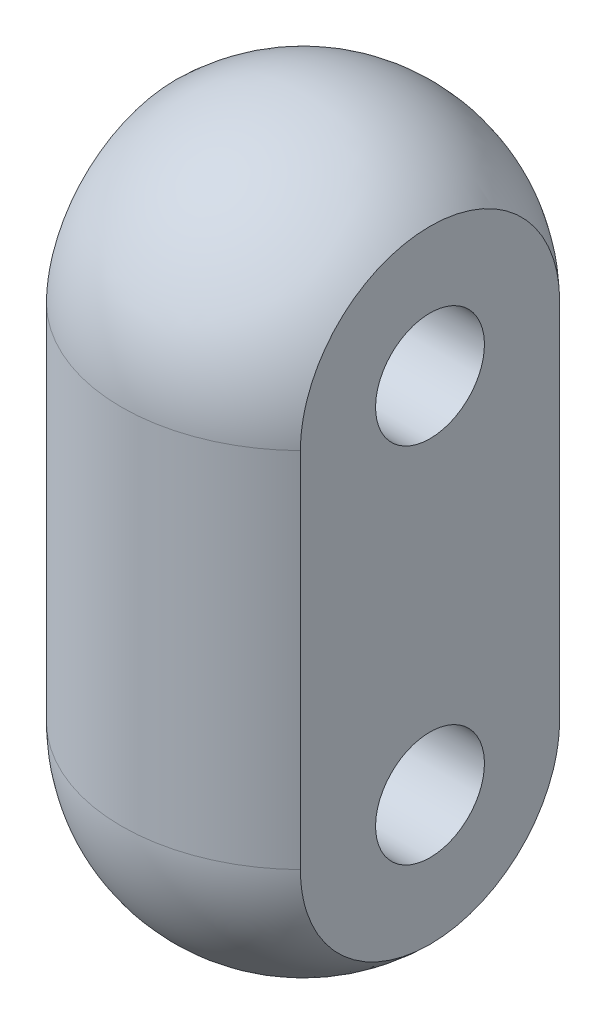
ISO-10303-21;
HEADER;
FILE_DESCRIPTION(('STEP AP214'),'2;1');
FILE_NAME('part.step','',(''),(''),'','','');
FILE_SCHEMA(('AUTOMOTIVE_DESIGN { 1 0 10303 214 1 1 1 1 }'));
ENDSEC;
DATA;
#1=APPLICATION_CONTEXT('core data for automotive mechanical design processes');
#2=APPLICATION_PROTOCOL_DEFINITION('international standard','automotive_design',2000,#1);
#3=PRODUCT_CONTEXT('',#1,'mechanical');
#4=PRODUCT('Part','Part','',(#3));
#5=PRODUCT_RELATED_PRODUCT_CATEGORY('part','',(#4));
#6=PRODUCT_DEFINITION_FORMATION('','',#4);
#7=PRODUCT_DEFINITION_CONTEXT('part definition',#1,'design');
#8=PRODUCT_DEFINITION('design','',#6,#7);
#9=PRODUCT_DEFINITION_SHAPE('','',#8);
#10=(LENGTH_UNIT() NAMED_UNIT(*) SI_UNIT(.MILLI.,.METRE.));
#11=(NAMED_UNIT(*) PLANE_ANGLE_UNIT() SI_UNIT($,.RADIAN.));
#12=(NAMED_UNIT(*) SI_UNIT($,.STERADIAN.) SOLID_ANGLE_UNIT());
#13=UNCERTAINTY_MEASURE_WITH_UNIT(LENGTH_MEASURE(1.E-05),#10,'distance_accuracy_value','');
#14=(GEOMETRIC_REPRESENTATION_CONTEXT(3) GLOBAL_UNCERTAINTY_ASSIGNED_CONTEXT((#13)) GLOBAL_UNIT_ASSIGNED_CONTEXT((#10,
#11,#12)) REPRESENTATION_CONTEXT('',''));
#15=CARTESIAN_POINT('',(0.,0.,0.));
#16=DIRECTION('',(0.,0.,1.));
#17=DIRECTION('',(1.,0.,0.));
#18=AXIS2_PLACEMENT_3D('',#15,#16,#17);
#19=CARTESIAN_POINT('',(0.,100.,0.));
#20=DIRECTION('',(0.,-1.,0.));
#21=DIRECTION('',(0.,0.,-1.));
#22=AXIS2_PLACEMENT_3D('',#19,#20,#21);
#23=CYLINDRICAL_SURFACE('',#22,25.);
#24=CARTESIAN_POINT('',(0.,75.,0.));
#25=DIRECTION('',(0.,-1.,0.));
#26=DIRECTION('',(0.,0.,-1.));
#27=AXIS2_PLACEMENT_3D('',#24,#25,#26);
#28=CIRCLE('',#27,25.);
#29=CARTESIAN_POINT('',(17.5,75.,17.8535710713571));
#30=VERTEX_POINT('',#29);
#31=CARTESIAN_POINT('',(-17.5,75.,17.8535710713571));
#32=VERTEX_POINT('',#31);
#33=EDGE_CURVE('E92',#30,#32,#28,.T.);
#34=ORIENTED_EDGE('',*,*,#33,.T.);
#35=DIRECTION('',(0.,-1.,0.));
#36=VECTOR('',#35,1.);
#37=CARTESIAN_POINT('',(-17.5,100.,17.8535710713571));
#38=LINE('',#37,#36);
#39=CARTESIAN_POINT('',(-17.5,25.,17.8535710713571));
#40=VERTEX_POINT('',#39);
#41=EDGE_CURVE('E105',#32,#40,#38,.T.);
#42=ORIENTED_EDGE('',*,*,#41,.T.);
#43=CARTESIAN_POINT('',(0.,25.,0.));
#44=DIRECTION('',(0.,-1.,0.));
#45=DIRECTION('',(0.,0.,-1.));
#46=AXIS2_PLACEMENT_3D('',#43,#44,#45);
#47=CIRCLE('',#46,25.);
#48=CARTESIAN_POINT('',(17.5,25.,17.8535710713571));
#49=VERTEX_POINT('',#48);
#50=EDGE_CURVE('E87',#40,#49,#47,.F.);
#51=ORIENTED_EDGE('',*,*,#50,.T.);
#52=DIRECTION('',(0.,-1.,0.));
#53=VECTOR('',#52,1.);
#54=CARTESIAN_POINT('',(17.5,100.,17.8535710713571));
#55=LINE('',#54,#53);
#56=EDGE_CURVE('E79',#49,#30,#55,.F.);
#57=ORIENTED_EDGE('',*,*,#56,.T.);
#58=EDGE_LOOP('',(#34,#42,#51,#57));
#59=FACE_BOUND('',#58,.T.);
#60=ADVANCED_FACE('F38',(#59),#23,.T.);
#61=CARTESIAN_POINT('',(17.5,25.,-17.8535710713571));
#62=VERTEX_POINT('',#61);
#63=CARTESIAN_POINT('',(-17.5,25.,-17.8535710713571));
#64=VERTEX_POINT('',#63);
#65=EDGE_CURVE('E97',#62,#64,#47,.F.);
#66=ORIENTED_EDGE('',*,*,#65,.T.);
#67=DIRECTION('',(0.,-1.,0.));
#68=VECTOR('',#67,1.);
#69=CARTESIAN_POINT('',(-17.5,100.,-17.8535710713571));
#70=LINE('',#69,#68);
#71=CARTESIAN_POINT('',(-17.5,75.,-17.8535710713571));
#72=VERTEX_POINT('',#71);
#73=EDGE_CURVE('E107',#64,#72,#70,.F.);
#74=ORIENTED_EDGE('',*,*,#73,.T.);
#75=CARTESIAN_POINT('',(17.5,75.,-17.8535710713571));
#76=VERTEX_POINT('',#75);
#77=EDGE_CURVE('E98',#72,#76,#28,.T.);
#78=ORIENTED_EDGE('',*,*,#77,.T.);
#79=DIRECTION('',(0.,-1.,0.));
#80=VECTOR('',#79,1.);
#81=CARTESIAN_POINT('',(17.5,100.,-17.8535710713571));
#82=LINE('',#81,#80);
#83=EDGE_CURVE('E82',#76,#62,#82,.T.);
#84=ORIENTED_EDGE('',*,*,#83,.T.);
#85=EDGE_LOOP('',(#66,#74,#78,#84));
#86=FACE_BOUND('',#85,.T.);
#87=ADVANCED_FACE('F145',(#86),#23,.T.);
#88=CARTESIAN_POINT('',(0.,25.,0.));
#89=DIRECTION('',(0.,0.,1.));
#90=DIRECTION('',(1.,0.,0.));
#91=AXIS2_PLACEMENT_3D('',#88,#89,#90);
#92=SPHERICAL_SURFACE('',#91,25.);
#93=CARTESIAN_POINT('',(0.,0.,0.));
#94=VERTEX_POINT('',#93);
#95=VERTEX_LOOP('',#94);
#96=FACE_BOUND('',#95,.T.);
#97=CARTESIAN_POINT('',(-17.5,25.,0.));
#98=DIRECTION('',(1.,0.,0.));
#99=DIRECTION('',(0.,1.,0.));
#100=AXIS2_PLACEMENT_3D('',#97,#98,#99);
#101=CIRCLE('',#100,17.8535710713571);
#102=EDGE_CURVE('E102',#64,#40,#101,.F.);
#103=ORIENTED_EDGE('',*,*,#102,.F.);
#104=ORIENTED_EDGE('',*,*,#65,.F.);
#105=CARTESIAN_POINT('',(17.5,25.,0.));
#106=DIRECTION('',(-1.,0.,0.));
#107=DIRECTION('',(0.,-1.,0.));
#108=AXIS2_PLACEMENT_3D('',#105,#106,#107);
#109=CIRCLE('',#108,17.8535710713571);
#110=EDGE_CURVE('E110',#49,#62,#109,.F.);
#111=ORIENTED_EDGE('',*,*,#110,.F.);
#112=ORIENTED_EDGE('',*,*,#50,.F.);
#113=EDGE_LOOP('',(#103,#104,#111,#112));
#114=FACE_BOUND('',#113,.T.);
#115=ADVANCED_FACE('F143',(#96,#114),#92,.T.);
#116=CARTESIAN_POINT('',(0.,75.,0.));
#117=DIRECTION('',(0.,0.,1.));
#118=DIRECTION('',(1.,0.,0.));
#119=AXIS2_PLACEMENT_3D('',#116,#117,#118);
#120=SPHERICAL_SURFACE('',#119,25.);
#121=CARTESIAN_POINT('',(0.,100.,0.));
#122=VERTEX_POINT('',#121);
#123=VERTEX_LOOP('',#122);
#124=FACE_BOUND('',#123,.T.);
#125=CARTESIAN_POINT('',(-17.5,75.,0.));
#126=DIRECTION('',(1.,0.,0.));
#127=DIRECTION('',(0.,1.,0.));
#128=AXIS2_PLACEMENT_3D('',#125,#126,#127);
#129=CIRCLE('',#128,17.8535710713571);
#130=EDGE_CURVE('E12',#32,#72,#129,.F.);
#131=ORIENTED_EDGE('',*,*,#130,.F.);
#132=ORIENTED_EDGE('',*,*,#33,.F.);
#133=CARTESIAN_POINT('',(17.5,75.,0.));
#134=DIRECTION('',(-1.,0.,0.));
#135=DIRECTION('',(0.,-1.,0.));
#136=AXIS2_PLACEMENT_3D('',#133,#134,#135);
#137=CIRCLE('',#136,17.8535710713571);
#138=EDGE_CURVE('E46',#76,#30,#137,.F.);
#139=ORIENTED_EDGE('',*,*,#138,.F.);
#140=ORIENTED_EDGE('',*,*,#77,.F.);
#141=EDGE_LOOP('',(#131,#132,#139,#140));
#142=FACE_BOUND('',#141,.T.);
#143=ADVANCED_FACE('F40',(#124,#142),#120,.T.);
#144=CARTESIAN_POINT('',(17.5,100.,200.));
#145=DIRECTION('',(-1.,0.,0.));
#146=DIRECTION('',(0.,-1.,0.));
#147=AXIS2_PLACEMENT_3D('',#144,#145,#146);
#148=PLANE('',#147);
#149=CARTESIAN_POINT('',(17.5,25.,0.));
#150=DIRECTION('',(-1.,0.,0.));
#151=DIRECTION('',(0.,-1.,0.));
#152=AXIS2_PLACEMENT_3D('',#149,#150,#151);
#153=CIRCLE('',#152,7.5);
#154=CARTESIAN_POINT('',(17.5,17.5,0.));
#155=VERTEX_POINT('',#154);
#156=EDGE_CURVE('E116',#155,#155,#153,.T.);
#157=ORIENTED_EDGE('',*,*,#156,.T.);
#158=EDGE_LOOP('',(#157));
#159=FACE_BOUND('',#158,.T.);
#160=CARTESIAN_POINT('',(17.5,75.,0.));
#161=DIRECTION('',(-1.,0.,0.));
#162=DIRECTION('',(0.,-1.,0.));
#163=AXIS2_PLACEMENT_3D('',#160,#161,#162);
#164=CIRCLE('',#163,7.5);
#165=CARTESIAN_POINT('',(17.5,67.5,0.));
#166=VERTEX_POINT('',#165);
#167=EDGE_CURVE('E94',#166,#166,#164,.T.);
#168=ORIENTED_EDGE('',*,*,#167,.T.);
#169=EDGE_LOOP('',(#168));
#170=FACE_BOUND('',#169,.T.);
#171=ORIENTED_EDGE('',*,*,#110,.T.);
#172=ORIENTED_EDGE('',*,*,#83,.F.);
#173=ORIENTED_EDGE('',*,*,#138,.T.);
#174=ORIENTED_EDGE('',*,*,#56,.F.);
#175=EDGE_LOOP('',(#171,#172,#173,#174));
#176=FACE_BOUND('',#175,.T.);
#177=ADVANCED_FACE('F78',(#159,#170,#176),#148,.F.);
#178=CARTESIAN_POINT('',(-17.5,100.,200.));
#179=DIRECTION('',(1.,0.,0.));
#180=DIRECTION('',(0.,1.,0.));
#181=AXIS2_PLACEMENT_3D('',#178,#179,#180);
#182=PLANE('',#181);
#183=CARTESIAN_POINT('',(-17.5,25.,0.));
#184=DIRECTION('',(-1.,0.,0.));
#185=DIRECTION('',(0.,-1.,0.));
#186=AXIS2_PLACEMENT_3D('',#183,#184,#185);
#187=CIRCLE('',#186,7.5);
#188=CARTESIAN_POINT('',(-17.5,17.5,0.));
#189=VERTEX_POINT('',#188);
#190=EDGE_CURVE('E119',#189,#189,#187,.T.);
#191=ORIENTED_EDGE('',*,*,#190,.F.);
#192=EDGE_LOOP('',(#191));
#193=FACE_BOUND('',#192,.T.);
#194=CARTESIAN_POINT('',(-17.5,75.,0.));
#195=DIRECTION('',(-1.,0.,0.));
#196=DIRECTION('',(0.,-1.,0.));
#197=AXIS2_PLACEMENT_3D('',#194,#195,#196);
#198=CIRCLE('',#197,7.5);
#199=CARTESIAN_POINT('',(-17.5,67.5,0.));
#200=VERTEX_POINT('',#199);
#201=EDGE_CURVE('E113',#200,#200,#198,.T.);
#202=ORIENTED_EDGE('',*,*,#201,.F.);
#203=EDGE_LOOP('',(#202));
#204=FACE_BOUND('',#203,.T.);
#205=ORIENTED_EDGE('',*,*,#102,.T.);
#206=ORIENTED_EDGE('',*,*,#41,.F.);
#207=ORIENTED_EDGE('',*,*,#130,.T.);
#208=ORIENTED_EDGE('',*,*,#73,.F.);
#209=EDGE_LOOP('',(#205,#206,#207,#208));
#210=FACE_BOUND('',#209,.T.);
#211=ADVANCED_FACE('F134',(#193,#204,#210),#182,.F.);
#212=CARTESIAN_POINT('',(17.5,75.,0.));
#213=DIRECTION('',(-1.,0.,0.));
#214=DIRECTION('',(0.,-1.,0.));
#215=AXIS2_PLACEMENT_3D('',#212,#213,#214);
#216=CYLINDRICAL_SURFACE('',#215,7.5);
#217=ORIENTED_EDGE('',*,*,#167,.F.);
#218=EDGE_LOOP('',(#217));
#219=FACE_BOUND('',#218,.T.);
#220=ORIENTED_EDGE('',*,*,#201,.T.);
#221=EDGE_LOOP('',(#220));
#222=FACE_BOUND('',#221,.T.);
#223=ADVANCED_FACE('F130',(#219,#222),#216,.F.);
#224=CARTESIAN_POINT('',(17.5,25.,0.));
#225=DIRECTION('',(-1.,0.,0.));
#226=DIRECTION('',(0.,-1.,0.));
#227=AXIS2_PLACEMENT_3D('',#224,#225,#226);
#228=CYLINDRICAL_SURFACE('',#227,7.5);
#229=ORIENTED_EDGE('',*,*,#156,.F.);
#230=EDGE_LOOP('',(#229));
#231=FACE_BOUND('',#230,.T.);
#232=ORIENTED_EDGE('',*,*,#190,.T.);
#233=EDGE_LOOP('',(#232));
#234=FACE_BOUND('',#233,.T.);
#235=ADVANCED_FACE('F127',(#231,#234),#228,.F.);
#236=CLOSED_SHELL('',(#60,#87,#115,#143,#177,#211,#223,#235));
#237=MANIFOLD_SOLID_BREP('B2',#236);
#238=ADVANCED_BREP_SHAPE_REPRESENTATION('',(#18,#237),#14);
#239=SHAPE_DEFINITION_REPRESENTATION(#9,#238);
ENDSEC;
END-ISO-10303-21;
